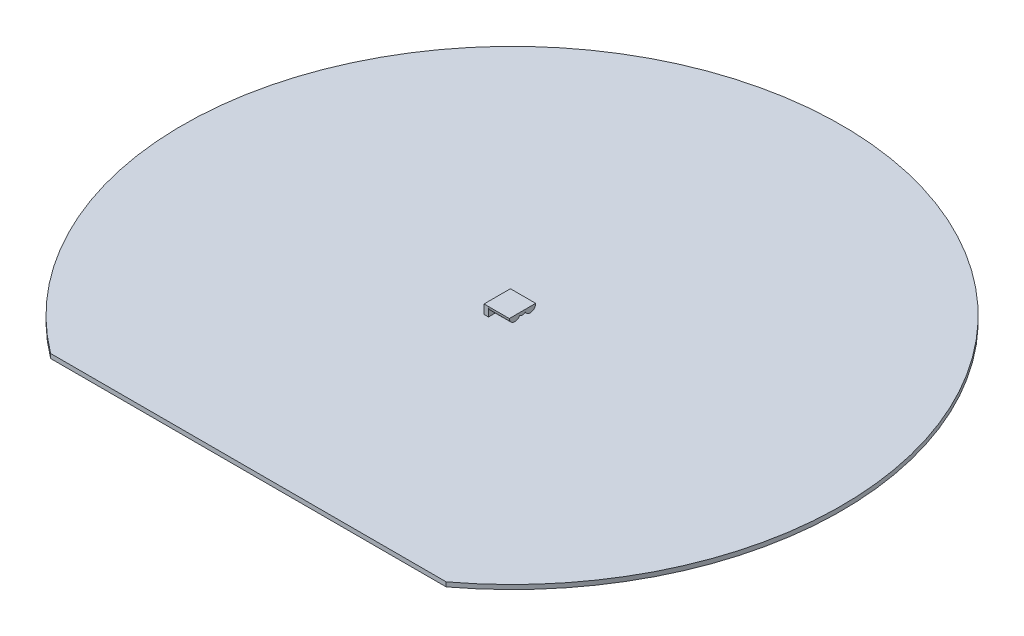
ISO-10303-21;
HEADER;
FILE_DESCRIPTION(('STEP AP214'),'2;1');
FILE_NAME('part.step','',(''),(''),'','','');
FILE_SCHEMA(('AUTOMOTIVE_DESIGN { 1 0 10303 214 1 1 1 1 }'));
ENDSEC;
DATA;
#1=APPLICATION_CONTEXT('core data for automotive mechanical design processes');
#2=APPLICATION_PROTOCOL_DEFINITION('international standard','automotive_design',2000,#1);
#3=PRODUCT_CONTEXT('',#1,'mechanical');
#4=PRODUCT('Part','Part','',(#3));
#5=PRODUCT_RELATED_PRODUCT_CATEGORY('part','',(#4));
#6=PRODUCT_DEFINITION_FORMATION('','',#4);
#7=PRODUCT_DEFINITION_CONTEXT('part definition',#1,'design');
#8=PRODUCT_DEFINITION('design','',#6,#7);
#9=PRODUCT_DEFINITION_SHAPE('','',#8);
#10=(LENGTH_UNIT() NAMED_UNIT(*) SI_UNIT(.MILLI.,.METRE.));
#11=(NAMED_UNIT(*) PLANE_ANGLE_UNIT() SI_UNIT($,.RADIAN.));
#12=(NAMED_UNIT(*) SI_UNIT($,.STERADIAN.) SOLID_ANGLE_UNIT());
#13=UNCERTAINTY_MEASURE_WITH_UNIT(LENGTH_MEASURE(1.E-05),#10,'distance_accuracy_value','');
#14=(GEOMETRIC_REPRESENTATION_CONTEXT(3) GLOBAL_UNCERTAINTY_ASSIGNED_CONTEXT((#13)) GLOBAL_UNIT_ASSIGNED_CONTEXT((#10,
#11,#12)) REPRESENTATION_CONTEXT('',''));
#15=CARTESIAN_POINT('',(0.,0.,0.));
#16=DIRECTION('',(0.,0.,1.));
#17=DIRECTION('',(1.,0.,0.));
#18=AXIS2_PLACEMENT_3D('',#15,#16,#17);
#19=CARTESIAN_POINT('',(4.75,9.,0.));
#20=DIRECTION('',(-1.,0.,0.));
#21=DIRECTION('',(0.,0.,1.));
#22=AXIS2_PLACEMENT_3D('',#19,#20,#21);
#23=PLANE('',#22);
#24=CARTESIAN_POINT('',(4.75,6.15,-3.5));
#25=DIRECTION('',(1.,0.,0.));
#26=DIRECTION('',(0.,0.,-1.));
#27=AXIS2_PLACEMENT_3D('',#24,#25,#26);
#28=CIRCLE('',#27,2.5);
#29=CARTESIAN_POINT('',(4.75,5.06842429996881,-1.24607142857143));
#30=VERTEX_POINT('',#29);
#31=CARTESIAN_POINT('',(4.75,6.15,-6.));
#32=VERTEX_POINT('',#31);
#33=EDGE_CURVE('E161',#30,#32,#28,.T.);
#34=ORIENTED_EDGE('',*,*,#33,.T.);
#35=DIRECTION('',(0.,0.,-1.));
#36=VECTOR('',#35,1.);
#37=CARTESIAN_POINT('',(4.75,6.15,0.));
#38=LINE('',#37,#36);
#39=CARTESIAN_POINT('',(4.75,6.15,6.));
#40=VERTEX_POINT('',#39);
#41=EDGE_CURVE('E137',#40,#32,#38,.T.);
#42=ORIENTED_EDGE('',*,*,#41,.F.);
#43=CARTESIAN_POINT('',(4.75,6.15,3.5));
#44=DIRECTION('',(1.,0.,0.));
#45=DIRECTION('',(0.,0.,-1.));
#46=AXIS2_PLACEMENT_3D('',#43,#44,#45);
#47=CIRCLE('',#46,2.5);
#48=CARTESIAN_POINT('',(4.75,5.06842429996881,1.24607142857143));
#49=VERTEX_POINT('',#48);
#50=EDGE_CURVE('E58',#40,#49,#47,.T.);
#51=ORIENTED_EDGE('',*,*,#50,.T.);
#52=CARTESIAN_POINT('',(4.75,6.15,0.));
#53=DIRECTION('',(1.,0.,0.));
#54=DIRECTION('',(0.,0.,-1.));
#55=AXIS2_PLACEMENT_3D('',#52,#53,#54);
#56=CIRCLE('',#55,1.65);
#57=EDGE_CURVE('E158',#49,#30,#56,.T.);
#58=ORIENTED_EDGE('',*,*,#57,.T.);
#59=EDGE_LOOP('',(#34,#42,#51,#58));
#60=FACE_BOUND('',#59,.T.);
#61=ADVANCED_FACE('F35',(#60),#23,.F.);
#62=CARTESIAN_POINT('',(-25.25,0.,6.));
#63=DIRECTION('',(0.,0.,1.));
#64=DIRECTION('',(1.,0.,0.));
#65=AXIS2_PLACEMENT_3D('',#62,#63,#64);
#66=PLANE('',#65);
#67=DIRECTION('',(1.,0.,0.));
#68=VECTOR('',#67,1.);
#69=CARTESIAN_POINT('',(-25.25,2.,6.));
#70=LINE('',#69,#68);
#71=CARTESIAN_POINT('',(-6.75,2.,6.));
#72=VERTEX_POINT('',#71);
#73=CARTESIAN_POINT('',(-4.75,2.,6.));
#74=VERTEX_POINT('',#73);
#75=EDGE_CURVE('E132',#72,#74,#70,.T.);
#76=ORIENTED_EDGE('',*,*,#75,.T.);
#77=DIRECTION('',(0.,-1.,0.));
#78=VECTOR('',#77,1.);
#79=CARTESIAN_POINT('',(-4.75,0.,6.));
#80=LINE('',#79,#78);
#81=CARTESIAN_POINT('',(-4.75,6.15,6.));
#82=VERTEX_POINT('',#81);
#83=EDGE_CURVE('E168',#82,#74,#80,.T.);
#84=ORIENTED_EDGE('',*,*,#83,.F.);
#85=DIRECTION('',(1.,0.,0.));
#86=VECTOR('',#85,1.);
#87=CARTESIAN_POINT('',(-25.25,6.15,6.));
#88=LINE('',#87,#86);
#89=CARTESIAN_POINT('',(-6.75,6.15,6.));
#90=VERTEX_POINT('',#89);
#91=EDGE_CURVE('E133',#90,#82,#88,.T.);
#92=ORIENTED_EDGE('',*,*,#91,.F.);
#93=DIRECTION('',(0.,-1.,0.));
#94=VECTOR('',#93,1.);
#95=CARTESIAN_POINT('',(-6.75,9.,6.));
#96=LINE('',#95,#94);
#97=EDGE_CURVE('E119',#90,#72,#96,.T.);
#98=ORIENTED_EDGE('',*,*,#97,.T.);
#99=EDGE_LOOP('',(#76,#84,#92,#98));
#100=FACE_BOUND('',#99,.T.);
#101=ADVANCED_FACE('F187',(#100),#66,.T.);
#102=CARTESIAN_POINT('',(-25.25,0.,-6.));
#103=DIRECTION('',(0.,0.,1.));
#104=DIRECTION('',(0.,-1.,0.));
#105=AXIS2_PLACEMENT_3D('',#102,#103,#104);
#106=PLANE('',#105);
#107=DIRECTION('',(0.,-1.,0.));
#108=VECTOR('',#107,1.);
#109=CARTESIAN_POINT('',(-4.75,0.,-6.));
#110=LINE('',#109,#108);
#111=CARTESIAN_POINT('',(-4.75,6.15,-6.));
#112=VERTEX_POINT('',#111);
#113=CARTESIAN_POINT('',(-4.75,2.,-6.));
#114=VERTEX_POINT('',#113);
#115=EDGE_CURVE('E151',#112,#114,#110,.T.);
#116=ORIENTED_EDGE('',*,*,#115,.T.);
#117=DIRECTION('',(1.,0.,0.));
#118=VECTOR('',#117,1.);
#119=CARTESIAN_POINT('',(-25.25,2.,-6.));
#120=LINE('',#119,#118);
#121=CARTESIAN_POINT('',(-6.75,2.,-6.));
#122=VERTEX_POINT('',#121);
#123=EDGE_CURVE('E140',#122,#114,#120,.T.);
#124=ORIENTED_EDGE('',*,*,#123,.F.);
#125=DIRECTION('',(0.,-1.,0.));
#126=VECTOR('',#125,1.);
#127=CARTESIAN_POINT('',(-6.75,9.00000000000001,-6.));
#128=LINE('',#127,#126);
#129=CARTESIAN_POINT('',(-6.75,6.15,-6.));
#130=VERTEX_POINT('',#129);
#131=EDGE_CURVE('E125',#130,#122,#128,.T.);
#132=ORIENTED_EDGE('',*,*,#131,.F.);
#133=DIRECTION('',(1.,0.,0.));
#134=VECTOR('',#133,1.);
#135=CARTESIAN_POINT('',(-25.25,6.15,-6.));
#136=LINE('',#135,#134);
#137=EDGE_CURVE('E136',#130,#112,#136,.T.);
#138=ORIENTED_EDGE('',*,*,#137,.T.);
#139=EDGE_LOOP('',(#116,#124,#132,#138));
#140=FACE_BOUND('',#139,.T.);
#141=ADVANCED_FACE('F194',(#140),#106,.F.);
#142=CARTESIAN_POINT('',(-6.75,9.,0.));
#143=DIRECTION('',(1.,0.,0.));
#144=DIRECTION('',(0.,0.,-1.));
#145=AXIS2_PLACEMENT_3D('',#142,#143,#144);
#146=PLANE('',#145);
#147=ORIENTED_EDGE('',*,*,#97,.F.);
#148=DIRECTION('',(0.,0.,-1.));
#149=VECTOR('',#148,1.);
#150=CARTESIAN_POINT('',(-6.75,6.15,0.));
#151=LINE('',#150,#149);
#152=EDGE_CURVE('E129',#90,#130,#151,.T.);
#153=ORIENTED_EDGE('',*,*,#152,.T.);
#154=ORIENTED_EDGE('',*,*,#131,.T.);
#155=DIRECTION('',(0.,0.,1.));
#156=VECTOR('',#155,1.);
#157=CARTESIAN_POINT('',(-6.75,2.,0.));
#158=LINE('',#157,#156);
#159=EDGE_CURVE('E117',#122,#72,#158,.T.);
#160=ORIENTED_EDGE('',*,*,#159,.T.);
#161=EDGE_LOOP('',(#147,#153,#154,#160));
#162=FACE_BOUND('',#161,.T.);
#163=ADVANCED_FACE('F182',(#162),#146,.F.);
#164=CARTESIAN_POINT('',(0.,2.,0.));
#165=DIRECTION('',(0.,1.,0.));
#166=DIRECTION('',(0.,0.,1.));
#167=AXIS2_PLACEMENT_3D('',#164,#165,#166);
#168=PLANE('',#167);
#169=DIRECTION('',(-1.,0.,0.));
#170=VECTOR('',#169,1.);
#171=CARTESIAN_POINT('',(-89.9999999999999,2.,120.));
#172=LINE('',#171,#170);
#173=CARTESIAN_POINT('',(89.9999999999999,2.,120.));
#174=VERTEX_POINT('',#173);
#175=CARTESIAN_POINT('',(-89.9999999999999,2.,120.));
#176=VERTEX_POINT('',#175);
#177=EDGE_CURVE('E111',#174,#176,#172,.T.);
#178=ORIENTED_EDGE('',*,*,#177,.F.);
#179=CARTESIAN_POINT('',(0.,2.,0.));
#180=DIRECTION('',(0.,1.,0.));
#181=DIRECTION('',(0.,0.,1.));
#182=AXIS2_PLACEMENT_3D('',#179,#180,#181);
#183=CIRCLE('',#182,150.);
#184=EDGE_CURVE('E11',#174,#176,#183,.T.);
#185=ORIENTED_EDGE('',*,*,#184,.T.);
#186=EDGE_LOOP('',(#178,#185));
#187=FACE_BOUND('',#186,.T.);
#188=ORIENTED_EDGE('',*,*,#75,.F.);
#189=ORIENTED_EDGE('',*,*,#159,.F.);
#190=ORIENTED_EDGE('',*,*,#123,.T.);
#191=DIRECTION('',(0.,0.,-1.));
#192=VECTOR('',#191,1.);
#193=CARTESIAN_POINT('',(-4.75,2.,0.));
#194=LINE('',#193,#192);
#195=EDGE_CURVE('E166',#74,#114,#194,.T.);
#196=ORIENTED_EDGE('',*,*,#195,.F.);
#197=EDGE_LOOP('',(#188,#189,#190,#196));
#198=FACE_BOUND('',#197,.T.);
#199=ADVANCED_FACE('F179',(#187,#198),#168,.T.);
#200=CARTESIAN_POINT('',(0.,2.,0.));
#201=DIRECTION('',(0.,-1.,0.));
#202=DIRECTION('',(0.,0.,-1.));
#203=AXIS2_PLACEMENT_3D('',#200,#201,#202);
#204=CYLINDRICAL_SURFACE('',#203,150.);
#205=ORIENTED_EDGE('',*,*,#184,.F.);
#206=DIRECTION('',(0.,1.,0.));
#207=VECTOR('',#206,1.);
#208=CARTESIAN_POINT('',(89.9999999999999,0.,120.));
#209=LINE('',#208,#207);
#210=CARTESIAN_POINT('',(89.9999999999999,0.,120.));
#211=VERTEX_POINT('',#210);
#212=EDGE_CURVE('E106',#211,#174,#209,.T.);
#213=ORIENTED_EDGE('',*,*,#212,.F.);
#214=CARTESIAN_POINT('',(0.,0.,0.));
#215=DIRECTION('',(0.,1.,0.));
#216=DIRECTION('',(0.,0.,1.));
#217=AXIS2_PLACEMENT_3D('',#214,#215,#216);
#218=CIRCLE('',#217,150.);
#219=CARTESIAN_POINT('',(-89.9999999999999,0.,120.));
#220=VERTEX_POINT('',#219);
#221=EDGE_CURVE('E39',#211,#220,#218,.T.);
#222=ORIENTED_EDGE('',*,*,#221,.T.);
#223=DIRECTION('',(0.,1.,0.));
#224=VECTOR('',#223,1.);
#225=CARTESIAN_POINT('',(-89.9999999999999,0.,120.));
#226=LINE('',#225,#224);
#227=EDGE_CURVE('E50',#220,#176,#226,.T.);
#228=ORIENTED_EDGE('',*,*,#227,.T.);
#229=EDGE_LOOP('',(#205,#213,#222,#228));
#230=FACE_BOUND('',#229,.T.);
#231=ADVANCED_FACE('F37',(#230),#204,.T.);
#232=CARTESIAN_POINT('',(0.,0.,0.));
#233=DIRECTION('',(0.,1.,0.));
#234=DIRECTION('',(0.,0.,1.));
#235=AXIS2_PLACEMENT_3D('',#232,#233,#234);
#236=PLANE('',#235);
#237=ORIENTED_EDGE('',*,*,#221,.F.);
#238=DIRECTION('',(-1.,0.,0.));
#239=VECTOR('',#238,1.);
#240=CARTESIAN_POINT('',(-89.9999999999999,0.,120.));
#241=LINE('',#240,#239);
#242=EDGE_CURVE('E103',#211,#220,#241,.T.);
#243=ORIENTED_EDGE('',*,*,#242,.T.);
#244=EDGE_LOOP('',(#237,#243));
#245=FACE_BOUND('',#244,.T.);
#246=ADVANCED_FACE('F116',(#245),#236,.F.);
#247=CARTESIAN_POINT('',(-25.25,6.15,0.));
#248=DIRECTION('',(0.,-1.,0.));
#249=DIRECTION('',(0.,0.,-1.));
#250=AXIS2_PLACEMENT_3D('',#247,#248,#249);
#251=PLANE('',#250);
#252=ORIENTED_EDGE('',*,*,#91,.T.);
#253=DIRECTION('',(1.,0.,0.));
#254=VECTOR('',#253,1.);
#255=CARTESIAN_POINT('',(-4.75,6.15,6.));
#256=LINE('',#255,#254);
#257=EDGE_CURVE('E153',#82,#40,#256,.T.);
#258=ORIENTED_EDGE('',*,*,#257,.T.);
#259=ORIENTED_EDGE('',*,*,#41,.T.);
#260=DIRECTION('',(1.,0.,0.));
#261=VECTOR('',#260,1.);
#262=CARTESIAN_POINT('',(-4.75,6.15,-6.));
#263=LINE('',#262,#261);
#264=EDGE_CURVE('E147',#112,#32,#263,.T.);
#265=ORIENTED_EDGE('',*,*,#264,.F.);
#266=ORIENTED_EDGE('',*,*,#137,.F.);
#267=ORIENTED_EDGE('',*,*,#152,.F.);
#268=EDGE_LOOP('',(#252,#258,#259,#265,#266,#267));
#269=FACE_BOUND('',#268,.T.);
#270=ADVANCED_FACE('F191',(#269),#251,.F.);
#271=CARTESIAN_POINT('',(-4.75,6.15,-3.5));
#272=DIRECTION('',(1.,0.,0.));
#273=DIRECTION('',(0.,0.,-1.));
#274=AXIS2_PLACEMENT_3D('',#271,#272,#273);
#275=CYLINDRICAL_SURFACE('',#274,2.5);
#276=ORIENTED_EDGE('',*,*,#33,.F.);
#277=DIRECTION('',(1.,0.,0.));
#278=VECTOR('',#277,1.);
#279=CARTESIAN_POINT('',(-4.75,5.06842429996881,-1.24607142857143));
#280=LINE('',#279,#278);
#281=CARTESIAN_POINT('',(-4.75,5.06842429996881,-1.24607142857143));
#282=VERTEX_POINT('',#281);
#283=EDGE_CURVE('E148',#282,#30,#280,.T.);
#284=ORIENTED_EDGE('',*,*,#283,.F.);
#285=CARTESIAN_POINT('',(-4.75,6.15,-3.5));
#286=DIRECTION('',(1.,0.,0.));
#287=DIRECTION('',(0.,0.,-1.));
#288=AXIS2_PLACEMENT_3D('',#285,#286,#287);
#289=CIRCLE('',#288,2.5);
#290=EDGE_CURVE('E157',#282,#112,#289,.T.);
#291=ORIENTED_EDGE('',*,*,#290,.T.);
#292=ORIENTED_EDGE('',*,*,#264,.T.);
#293=EDGE_LOOP('',(#276,#284,#291,#292));
#294=FACE_BOUND('',#293,.T.);
#295=ADVANCED_FACE('F202',(#294),#275,.T.);
#296=CARTESIAN_POINT('',(-4.75,6.15,3.5));
#297=DIRECTION('',(1.,0.,0.));
#298=DIRECTION('',(0.,0.,-1.));
#299=AXIS2_PLACEMENT_3D('',#296,#297,#298);
#300=CYLINDRICAL_SURFACE('',#299,2.5);
#301=ORIENTED_EDGE('',*,*,#50,.F.);
#302=ORIENTED_EDGE('',*,*,#257,.F.);
#303=CARTESIAN_POINT('',(-4.75,6.15,3.5));
#304=DIRECTION('',(1.,0.,0.));
#305=DIRECTION('',(0.,0.,-1.));
#306=AXIS2_PLACEMENT_3D('',#303,#304,#305);
#307=CIRCLE('',#306,2.5);
#308=CARTESIAN_POINT('',(-4.75,5.06842429996881,1.24607142857143));
#309=VERTEX_POINT('',#308);
#310=EDGE_CURVE('E171',#82,#309,#307,.T.);
#311=ORIENTED_EDGE('',*,*,#310,.T.);
#312=DIRECTION('',(1.,0.,0.));
#313=VECTOR('',#312,1.);
#314=CARTESIAN_POINT('',(-4.75,5.06842429996881,1.24607142857143));
#315=LINE('',#314,#313);
#316=EDGE_CURVE('E150',#309,#49,#315,.T.);
#317=ORIENTED_EDGE('',*,*,#316,.T.);
#318=EDGE_LOOP('',(#301,#302,#311,#317));
#319=FACE_BOUND('',#318,.T.);
#320=ADVANCED_FACE('F208',(#319),#300,.T.);
#321=CARTESIAN_POINT('',(-4.75,6.15,0.));
#322=DIRECTION('',(1.,0.,0.));
#323=DIRECTION('',(0.,0.,-1.));
#324=AXIS2_PLACEMENT_3D('',#321,#322,#323);
#325=CYLINDRICAL_SURFACE('',#324,1.65);
#326=ORIENTED_EDGE('',*,*,#57,.F.);
#327=ORIENTED_EDGE('',*,*,#316,.F.);
#328=CARTESIAN_POINT('',(-4.75,6.15,0.));
#329=DIRECTION('',(1.,0.,0.));
#330=DIRECTION('',(0.,0.,-1.));
#331=AXIS2_PLACEMENT_3D('',#328,#329,#330);
#332=CIRCLE('',#331,1.65);
#333=EDGE_CURVE('E173',#309,#282,#332,.T.);
#334=ORIENTED_EDGE('',*,*,#333,.T.);
#335=ORIENTED_EDGE('',*,*,#283,.T.);
#336=EDGE_LOOP('',(#326,#327,#334,#335));
#337=FACE_BOUND('',#336,.T.);
#338=ADVANCED_FACE('F205',(#337),#325,.T.);
#339=CARTESIAN_POINT('',(-4.75,0.,0.));
#340=DIRECTION('',(1.,0.,0.));
#341=DIRECTION('',(0.,0.,-1.));
#342=AXIS2_PLACEMENT_3D('',#339,#340,#341);
#343=PLANE('',#342);
#344=ORIENTED_EDGE('',*,*,#290,.F.);
#345=ORIENTED_EDGE('',*,*,#333,.F.);
#346=ORIENTED_EDGE('',*,*,#310,.F.);
#347=ORIENTED_EDGE('',*,*,#83,.T.);
#348=ORIENTED_EDGE('',*,*,#195,.T.);
#349=ORIENTED_EDGE('',*,*,#115,.F.);
#350=EDGE_LOOP('',(#344,#345,#346,#347,#348,#349));
#351=FACE_BOUND('',#350,.T.);
#352=ADVANCED_FACE('F197',(#351),#343,.T.);
#353=CARTESIAN_POINT('',(-89.9999999999999,0.,120.));
#354=DIRECTION('',(0.,0.,-1.));
#355=DIRECTION('',(-1.,0.,0.));
#356=AXIS2_PLACEMENT_3D('',#353,#354,#355);
#357=PLANE('',#356);
#358=ORIENTED_EDGE('',*,*,#177,.T.);
#359=ORIENTED_EDGE('',*,*,#227,.F.);
#360=ORIENTED_EDGE('',*,*,#242,.F.);
#361=ORIENTED_EDGE('',*,*,#212,.T.);
#362=EDGE_LOOP('',(#358,#359,#360,#361));
#363=FACE_BOUND('',#362,.T.);
#364=ADVANCED_FACE('F105',(#363),#357,.F.);
#365=CLOSED_SHELL('',(#61,#101,#141,#163,#199,#231,#246,#270,#295,#320,#338,#352,#364));
#366=MANIFOLD_SOLID_BREP('B2',#365);
#367=ADVANCED_BREP_SHAPE_REPRESENTATION('',(#18,#366),#14);
#368=SHAPE_DEFINITION_REPRESENTATION(#9,#367);
ENDSEC;
END-ISO-10303-21;
